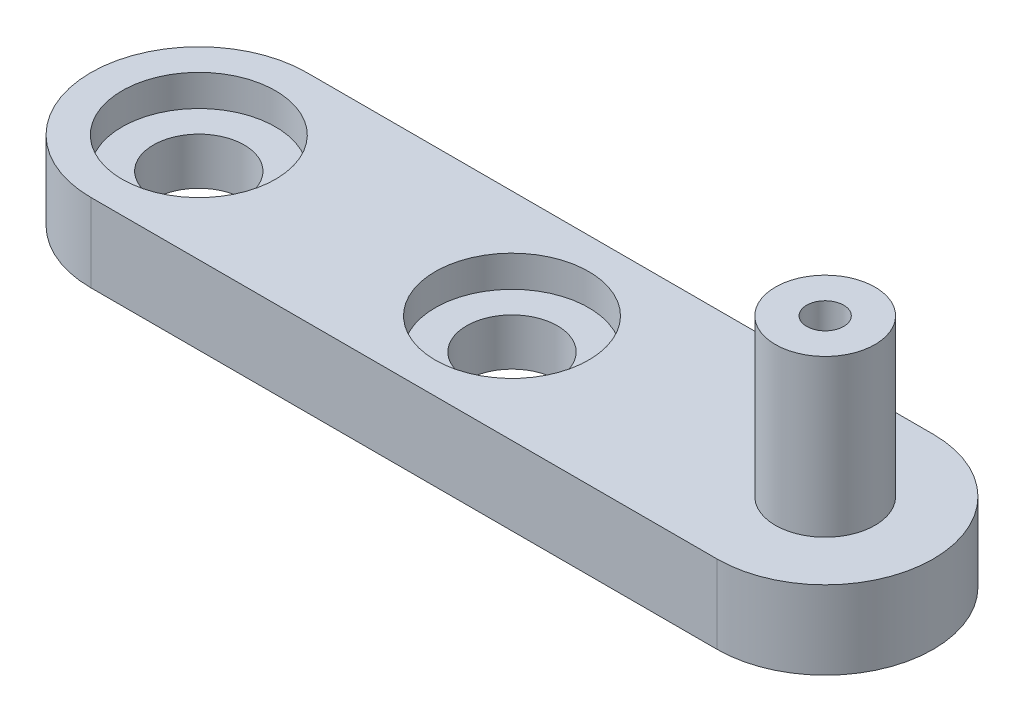
ISO-10303-21;
HEADER;
FILE_DESCRIPTION(('STEP AP214'),'2;1');
FILE_NAME('part.step','',(''),(''),'','','');
FILE_SCHEMA(('AUTOMOTIVE_DESIGN { 1 0 10303 214 1 1 1 1 }'));
ENDSEC;
DATA;
#1=APPLICATION_CONTEXT('core data for automotive mechanical design processes');
#2=APPLICATION_PROTOCOL_DEFINITION('international standard','automotive_design',2000,#1);
#3=PRODUCT_CONTEXT('',#1,'mechanical');
#4=PRODUCT('Part','Part','',(#3));
#5=PRODUCT_RELATED_PRODUCT_CATEGORY('part','',(#4));
#6=PRODUCT_DEFINITION_FORMATION('','',#4);
#7=PRODUCT_DEFINITION_CONTEXT('part definition',#1,'design');
#8=PRODUCT_DEFINITION('design','',#6,#7);
#9=PRODUCT_DEFINITION_SHAPE('','',#8);
#10=(LENGTH_UNIT() NAMED_UNIT(*) SI_UNIT(.MILLI.,.METRE.));
#11=(NAMED_UNIT(*) PLANE_ANGLE_UNIT() SI_UNIT($,.RADIAN.));
#12=(NAMED_UNIT(*) SI_UNIT($,.STERADIAN.) SOLID_ANGLE_UNIT());
#13=UNCERTAINTY_MEASURE_WITH_UNIT(LENGTH_MEASURE(1.E-05),#10,'distance_accuracy_value','');
#14=(GEOMETRIC_REPRESENTATION_CONTEXT(3) GLOBAL_UNCERTAINTY_ASSIGNED_CONTEXT((#13)) GLOBAL_UNIT_ASSIGNED_CONTEXT((#10,
#11,#12)) REPRESENTATION_CONTEXT('',''));
#15=CARTESIAN_POINT('',(0.,0.,0.));
#16=DIRECTION('',(0.,0.,1.));
#17=DIRECTION('',(1.,0.,0.));
#18=AXIS2_PLACEMENT_3D('',#15,#16,#17);
#19=CARTESIAN_POINT('',(0.,2.5,0.));
#20=DIRECTION('',(0.,-1.,0.));
#21=DIRECTION('',(0.,0.,-1.));
#22=AXIS2_PLACEMENT_3D('',#19,#20,#21);
#23=CYLINDRICAL_SURFACE('',#22,1.45);
#24=CARTESIAN_POINT('',(0.,0.,0.));
#25=DIRECTION('',(0.,1.,0.));
#26=DIRECTION('',(0.,0.,1.));
#27=AXIS2_PLACEMENT_3D('',#24,#25,#26);
#28=CIRCLE('',#27,1.45);
#29=CARTESIAN_POINT('',(0.,0.,1.45));
#30=VERTEX_POINT('',#29);
#31=EDGE_CURVE('E109',#30,#30,#28,.T.);
#32=ORIENTED_EDGE('',*,*,#31,.F.);
#33=EDGE_LOOP('',(#32));
#34=FACE_BOUND('',#33,.T.);
#35=CARTESIAN_POINT('',(0.,1.5,0.));
#36=DIRECTION('',(0.,1.,0.));
#37=DIRECTION('',(0.,0.,1.));
#38=AXIS2_PLACEMENT_3D('',#35,#36,#37);
#39=CIRCLE('',#38,1.45);
#40=CARTESIAN_POINT('',(0.,1.5,1.45));
#41=VERTEX_POINT('',#40);
#42=EDGE_CURVE('E118',#41,#41,#39,.T.);
#43=ORIENTED_EDGE('',*,*,#42,.T.);
#44=EDGE_LOOP('',(#43));
#45=FACE_BOUND('',#44,.T.);
#46=ADVANCED_FACE('F39',(#34,#45),#23,.F.);
#47=CARTESIAN_POINT('',(10.,2.5,0.));
#48=DIRECTION('',(0.,-1.,0.));
#49=DIRECTION('',(0.,0.,-1.));
#50=AXIS2_PLACEMENT_3D('',#47,#48,#49);
#51=CYLINDRICAL_SURFACE('',#50,1.45);
#52=CARTESIAN_POINT('',(10.,0.,0.));
#53=DIRECTION('',(0.,1.,0.));
#54=DIRECTION('',(0.,0.,1.));
#55=AXIS2_PLACEMENT_3D('',#52,#53,#54);
#56=CIRCLE('',#55,1.45);
#57=CARTESIAN_POINT('',(10.,0.,1.45));
#58=VERTEX_POINT('',#57);
#59=EDGE_CURVE('E121',#58,#58,#56,.T.);
#60=ORIENTED_EDGE('',*,*,#59,.F.);
#61=EDGE_LOOP('',(#60));
#62=FACE_BOUND('',#61,.T.);
#63=CARTESIAN_POINT('',(10.,1.5,0.));
#64=DIRECTION('',(0.,1.,0.));
#65=DIRECTION('',(0.,0.,1.));
#66=AXIS2_PLACEMENT_3D('',#63,#64,#65);
#67=CIRCLE('',#66,1.45);
#68=CARTESIAN_POINT('',(10.,1.5,1.45));
#69=VERTEX_POINT('',#68);
#70=EDGE_CURVE('E116',#69,#69,#67,.T.);
#71=ORIENTED_EDGE('',*,*,#70,.T.);
#72=EDGE_LOOP('',(#71));
#73=FACE_BOUND('',#72,.T.);
#74=ADVANCED_FACE('F187',(#62,#73),#51,.F.);
#75=CARTESIAN_POINT('',(0.,2.5,0.));
#76=DIRECTION('',(0.,1.,0.));
#77=DIRECTION('',(0.,0.,1.));
#78=AXIS2_PLACEMENT_3D('',#75,#76,#77);
#79=PLANE('',#78);
#80=CARTESIAN_POINT('',(20.,2.5,0.));
#81=DIRECTION('',(0.,1.,0.));
#82=DIRECTION('',(0.,0.,1.));
#83=AXIS2_PLACEMENT_3D('',#80,#81,#82);
#84=CIRCLE('',#83,1.59);
#85=CARTESIAN_POINT('',(20.,2.5,1.59));
#86=VERTEX_POINT('',#85);
#87=EDGE_CURVE('E143',#86,#86,#84,.T.);
#88=ORIENTED_EDGE('',*,*,#87,.F.);
#89=EDGE_LOOP('',(#88));
#90=FACE_BOUND('',#89,.T.);
#91=CARTESIAN_POINT('',(10.,2.5,0.));
#92=DIRECTION('',(0.,1.,0.));
#93=DIRECTION('',(0.,0.,1.));
#94=AXIS2_PLACEMENT_3D('',#91,#92,#93);
#95=CIRCLE('',#94,2.45);
#96=CARTESIAN_POINT('',(10.,2.5,2.45));
#97=VERTEX_POINT('',#96);
#98=EDGE_CURVE('E138',#97,#97,#95,.T.);
#99=ORIENTED_EDGE('',*,*,#98,.F.);
#100=EDGE_LOOP('',(#99));
#101=FACE_BOUND('',#100,.T.);
#102=CARTESIAN_POINT('',(0.,2.5,0.));
#103=DIRECTION('',(0.,1.,0.));
#104=DIRECTION('',(0.,0.,1.));
#105=AXIS2_PLACEMENT_3D('',#102,#103,#104);
#106=CIRCLE('',#105,2.45);
#107=CARTESIAN_POINT('',(0.,2.5,2.45));
#108=VERTEX_POINT('',#107);
#109=EDGE_CURVE('E134',#108,#108,#106,.T.);
#110=ORIENTED_EDGE('',*,*,#109,.F.);
#111=EDGE_LOOP('',(#110));
#112=FACE_BOUND('',#111,.T.);
#113=CARTESIAN_POINT('',(0.,2.5,0.));
#114=DIRECTION('',(0.,1.,0.));
#115=DIRECTION('',(0.,0.,1.));
#116=AXIS2_PLACEMENT_3D('',#113,#114,#115);
#117=CIRCLE('',#116,3.45);
#118=CARTESIAN_POINT('',(0.,2.5,-3.45));
#119=VERTEX_POINT('',#118);
#120=CARTESIAN_POINT('',(0.,2.5,3.45));
#121=VERTEX_POINT('',#120);
#122=EDGE_CURVE('E92',#119,#121,#117,.T.);
#123=ORIENTED_EDGE('',*,*,#122,.T.);
#124=DIRECTION('',(1.,0.,0.));
#125=VECTOR('',#124,1.);
#126=CARTESIAN_POINT('',(0.,2.5,3.45));
#127=LINE('',#126,#125);
#128=CARTESIAN_POINT('',(20.,2.5,3.45));
#129=VERTEX_POINT('',#128);
#130=EDGE_CURVE('E87',#121,#129,#127,.T.);
#131=ORIENTED_EDGE('',*,*,#130,.T.);
#132=CARTESIAN_POINT('',(20.,2.5,0.));
#133=DIRECTION('',(0.,1.,0.));
#134=DIRECTION('',(0.,0.,1.));
#135=AXIS2_PLACEMENT_3D('',#132,#133,#134);
#136=CIRCLE('',#135,3.45);
#137=CARTESIAN_POINT('',(20.,2.5,-3.45));
#138=VERTEX_POINT('',#137);
#139=EDGE_CURVE('E90',#129,#138,#136,.T.);
#140=ORIENTED_EDGE('',*,*,#139,.T.);
#141=DIRECTION('',(-1.,0.,0.));
#142=VECTOR('',#141,1.);
#143=CARTESIAN_POINT('',(0.,2.5,-3.45));
#144=LINE('',#143,#142);
#145=EDGE_CURVE('E56',#138,#119,#144,.T.);
#146=ORIENTED_EDGE('',*,*,#145,.T.);
#147=EDGE_LOOP('',(#123,#131,#140,#146));
#148=FACE_BOUND('',#147,.T.);
#149=ADVANCED_FACE('F88',(#90,#101,#112,#148),#79,.T.);
#150=CARTESIAN_POINT('',(0.,0.,0.));
#151=DIRECTION('',(0.,1.,0.));
#152=DIRECTION('',(0.,0.,1.));
#153=AXIS2_PLACEMENT_3D('',#150,#151,#152);
#154=PLANE('',#153);
#155=CARTESIAN_POINT('',(20.,0.,0.));
#156=DIRECTION('',(0.,1.,0.));
#157=DIRECTION('',(0.,0.,1.));
#158=AXIS2_PLACEMENT_3D('',#155,#156,#157);
#159=CIRCLE('',#158,0.475000000000004);
#160=CARTESIAN_POINT('',(20.,0.,0.475000000000004));
#161=VERTEX_POINT('',#160);
#162=EDGE_CURVE('E151',#161,#161,#159,.T.);
#163=ORIENTED_EDGE('',*,*,#162,.T.);
#164=EDGE_LOOP('',(#163));
#165=FACE_BOUND('',#164,.T.);
#166=CARTESIAN_POINT('',(0.,0.,0.));
#167=DIRECTION('',(0.,1.,0.));
#168=DIRECTION('',(0.,0.,1.));
#169=AXIS2_PLACEMENT_3D('',#166,#167,#168);
#170=CIRCLE('',#169,3.45);
#171=CARTESIAN_POINT('',(0.,0.,-3.45));
#172=VERTEX_POINT('',#171);
#173=CARTESIAN_POINT('',(0.,0.,3.45));
#174=VERTEX_POINT('',#173);
#175=EDGE_CURVE('E106',#172,#174,#170,.T.);
#176=ORIENTED_EDGE('',*,*,#175,.F.);
#177=DIRECTION('',(-1.,0.,0.));
#178=VECTOR('',#177,1.);
#179=CARTESIAN_POINT('',(0.,0.,-3.45));
#180=LINE('',#179,#178);
#181=CARTESIAN_POINT('',(20.,0.,-3.45));
#182=VERTEX_POINT('',#181);
#183=EDGE_CURVE('E79',#182,#172,#180,.T.);
#184=ORIENTED_EDGE('',*,*,#183,.F.);
#185=CARTESIAN_POINT('',(20.,0.,0.));
#186=DIRECTION('',(0.,1.,0.));
#187=DIRECTION('',(0.,0.,1.));
#188=AXIS2_PLACEMENT_3D('',#185,#186,#187);
#189=CIRCLE('',#188,3.45);
#190=CARTESIAN_POINT('',(20.,0.,3.45));
#191=VERTEX_POINT('',#190);
#192=EDGE_CURVE('E73',#191,#182,#189,.T.);
#193=ORIENTED_EDGE('',*,*,#192,.F.);
#194=DIRECTION('',(1.,0.,0.));
#195=VECTOR('',#194,1.);
#196=CARTESIAN_POINT('',(0.,0.,3.45));
#197=LINE('',#196,#195);
#198=EDGE_CURVE('E97',#174,#191,#197,.T.);
#199=ORIENTED_EDGE('',*,*,#198,.F.);
#200=EDGE_LOOP('',(#176,#184,#193,#199));
#201=FACE_BOUND('',#200,.T.);
#202=ORIENTED_EDGE('',*,*,#31,.T.);
#203=EDGE_LOOP('',(#202));
#204=FACE_BOUND('',#203,.T.);
#205=ORIENTED_EDGE('',*,*,#59,.T.);
#206=EDGE_LOOP('',(#205));
#207=FACE_BOUND('',#206,.T.);
#208=ADVANCED_FACE('F158',(#165,#201,#204,#207),#154,.F.);
#209=CARTESIAN_POINT('',(0.,2.5,0.));
#210=DIRECTION('',(0.,-1.,0.));
#211=DIRECTION('',(0.,0.,-1.));
#212=AXIS2_PLACEMENT_3D('',#209,#210,#211);
#213=CYLINDRICAL_SURFACE('',#212,3.45);
#214=ORIENTED_EDGE('',*,*,#175,.T.);
#215=DIRECTION('',(0.,-1.,0.));
#216=VECTOR('',#215,1.);
#217=CARTESIAN_POINT('',(0.,2.5,3.45));
#218=LINE('',#217,#216);
#219=EDGE_CURVE('E48',#121,#174,#218,.T.);
#220=ORIENTED_EDGE('',*,*,#219,.F.);
#221=ORIENTED_EDGE('',*,*,#122,.F.);
#222=DIRECTION('',(0.,-1.,0.));
#223=VECTOR('',#222,1.);
#224=CARTESIAN_POINT('',(0.,2.5,-3.45));
#225=LINE('',#224,#223);
#226=EDGE_CURVE('E102',#119,#172,#225,.T.);
#227=ORIENTED_EDGE('',*,*,#226,.T.);
#228=EDGE_LOOP('',(#214,#220,#221,#227));
#229=FACE_BOUND('',#228,.T.);
#230=ADVANCED_FACE('F41',(#229),#213,.T.);
#231=CARTESIAN_POINT('',(0.,2.5,3.45));
#232=DIRECTION('',(0.,0.,-1.));
#233=DIRECTION('',(-1.,0.,0.));
#234=AXIS2_PLACEMENT_3D('',#231,#232,#233);
#235=PLANE('',#234);
#236=ORIENTED_EDGE('',*,*,#198,.T.);
#237=DIRECTION('',(0.,-1.,0.));
#238=VECTOR('',#237,1.);
#239=CARTESIAN_POINT('',(20.,2.5,3.45));
#240=LINE('',#239,#238);
#241=EDGE_CURVE('E95',#129,#191,#240,.T.);
#242=ORIENTED_EDGE('',*,*,#241,.F.);
#243=ORIENTED_EDGE('',*,*,#130,.F.);
#244=ORIENTED_EDGE('',*,*,#219,.T.);
#245=EDGE_LOOP('',(#236,#242,#243,#244));
#246=FACE_BOUND('',#245,.T.);
#247=ADVANCED_FACE('F96',(#246),#235,.F.);
#248=CARTESIAN_POINT('',(20.,2.5,0.));
#249=DIRECTION('',(0.,-1.,0.));
#250=DIRECTION('',(0.,0.,-1.));
#251=AXIS2_PLACEMENT_3D('',#248,#249,#250);
#252=CYLINDRICAL_SURFACE('',#251,3.45);
#253=ORIENTED_EDGE('',*,*,#192,.T.);
#254=DIRECTION('',(0.,-1.,0.));
#255=VECTOR('',#254,1.);
#256=CARTESIAN_POINT('',(20.,2.5,-3.45));
#257=LINE('',#256,#255);
#258=EDGE_CURVE('E98',#138,#182,#257,.T.);
#259=ORIENTED_EDGE('',*,*,#258,.F.);
#260=ORIENTED_EDGE('',*,*,#139,.F.);
#261=ORIENTED_EDGE('',*,*,#241,.T.);
#262=EDGE_LOOP('',(#253,#259,#260,#261));
#263=FACE_BOUND('',#262,.T.);
#264=ADVANCED_FACE('F100',(#263),#252,.T.);
#265=CARTESIAN_POINT('',(0.,2.5,-3.45));
#266=DIRECTION('',(0.,0.,1.));
#267=DIRECTION('',(1.,0.,0.));
#268=AXIS2_PLACEMENT_3D('',#265,#266,#267);
#269=PLANE('',#268);
#270=ORIENTED_EDGE('',*,*,#183,.T.);
#271=ORIENTED_EDGE('',*,*,#226,.F.);
#272=ORIENTED_EDGE('',*,*,#145,.F.);
#273=ORIENTED_EDGE('',*,*,#258,.T.);
#274=EDGE_LOOP('',(#270,#271,#272,#273));
#275=FACE_BOUND('',#274,.T.);
#276=ADVANCED_FACE('F202',(#275),#269,.F.);
#277=CARTESIAN_POINT('',(10.,1.5,0.));
#278=DIRECTION('',(0.,1.,0.));
#279=DIRECTION('',(0.,0.,1.));
#280=AXIS2_PLACEMENT_3D('',#277,#278,#279);
#281=CYLINDRICAL_SURFACE('',#280,2.45);
#282=CARTESIAN_POINT('',(10.,1.5,0.));
#283=DIRECTION('',(0.,1.,0.));
#284=DIRECTION('',(0.,0.,1.));
#285=AXIS2_PLACEMENT_3D('',#282,#283,#284);
#286=CIRCLE('',#285,2.45);
#287=CARTESIAN_POINT('',(10.,1.5,2.45));
#288=VERTEX_POINT('',#287);
#289=EDGE_CURVE('E119',#288,#288,#286,.T.);
#290=ORIENTED_EDGE('',*,*,#289,.F.);
#291=EDGE_LOOP('',(#290));
#292=FACE_BOUND('',#291,.T.);
#293=ORIENTED_EDGE('',*,*,#98,.T.);
#294=EDGE_LOOP('',(#293));
#295=FACE_BOUND('',#294,.T.);
#296=ADVANCED_FACE('F204',(#292,#295),#281,.F.);
#297=CARTESIAN_POINT('',(10.,1.5,0.));
#298=DIRECTION('',(0.,1.,0.));
#299=DIRECTION('',(0.,0.,1.));
#300=AXIS2_PLACEMENT_3D('',#297,#298,#299);
#301=PLANE('',#300);
#302=ORIENTED_EDGE('',*,*,#70,.F.);
#303=EDGE_LOOP('',(#302));
#304=FACE_BOUND('',#303,.T.);
#305=ORIENTED_EDGE('',*,*,#289,.T.);
#306=EDGE_LOOP('',(#305));
#307=FACE_BOUND('',#306,.T.);
#308=ADVANCED_FACE('F255',(#304,#307),#301,.T.);
#309=CARTESIAN_POINT('',(0.,1.5,0.));
#310=DIRECTION('',(0.,1.,0.));
#311=DIRECTION('',(0.,0.,1.));
#312=AXIS2_PLACEMENT_3D('',#309,#310,#311);
#313=CYLINDRICAL_SURFACE('',#312,2.45);
#314=CARTESIAN_POINT('',(0.,1.5,0.));
#315=DIRECTION('',(0.,1.,0.));
#316=DIRECTION('',(0.,0.,1.));
#317=AXIS2_PLACEMENT_3D('',#314,#315,#316);
#318=CIRCLE('',#317,2.45);
#319=CARTESIAN_POINT('',(0.,1.5,2.45));
#320=VERTEX_POINT('',#319);
#321=EDGE_CURVE('E131',#320,#320,#318,.T.);
#322=ORIENTED_EDGE('',*,*,#321,.F.);
#323=EDGE_LOOP('',(#322));
#324=FACE_BOUND('',#323,.T.);
#325=ORIENTED_EDGE('',*,*,#109,.T.);
#326=EDGE_LOOP('',(#325));
#327=FACE_BOUND('',#326,.T.);
#328=ADVANCED_FACE('F265',(#324,#327),#313,.F.);
#329=CARTESIAN_POINT('',(0.,1.5,0.));
#330=DIRECTION('',(0.,1.,0.));
#331=DIRECTION('',(0.,0.,1.));
#332=AXIS2_PLACEMENT_3D('',#329,#330,#331);
#333=PLANE('',#332);
#334=ORIENTED_EDGE('',*,*,#42,.F.);
#335=EDGE_LOOP('',(#334));
#336=FACE_BOUND('',#335,.T.);
#337=ORIENTED_EDGE('',*,*,#321,.T.);
#338=EDGE_LOOP('',(#337));
#339=FACE_BOUND('',#338,.T.);
#340=ADVANCED_FACE('F275',(#336,#339),#333,.T.);
#341=CARTESIAN_POINT('',(20.,7.5,0.));
#342=DIRECTION('',(0.,1.,0.));
#343=DIRECTION('',(0.,0.,1.));
#344=AXIS2_PLACEMENT_3D('',#341,#342,#343);
#345=PLANE('',#344);
#346=CARTESIAN_POINT('',(20.,7.5,0.));
#347=DIRECTION('',(0.,1.,0.));
#348=DIRECTION('',(0.,0.,1.));
#349=AXIS2_PLACEMENT_3D('',#346,#347,#348);
#350=CIRCLE('',#349,1.59);
#351=CARTESIAN_POINT('',(20.,7.5,1.59));
#352=VERTEX_POINT('',#351);
#353=EDGE_CURVE('E135',#352,#352,#350,.T.);
#354=ORIENTED_EDGE('',*,*,#353,.T.);
#355=EDGE_LOOP('',(#354));
#356=FACE_BOUND('',#355,.T.);
#357=CARTESIAN_POINT('',(20.,7.5,0.));
#358=DIRECTION('',(0.,1.,0.));
#359=DIRECTION('',(0.,0.,1.));
#360=AXIS2_PLACEMENT_3D('',#357,#358,#359);
#361=CIRCLE('',#360,0.59);
#362=CARTESIAN_POINT('',(20.,7.5,0.59));
#363=VERTEX_POINT('',#362);
#364=EDGE_CURVE('E146',#363,#363,#361,.T.);
#365=ORIENTED_EDGE('',*,*,#364,.F.);
#366=EDGE_LOOP('',(#365));
#367=FACE_BOUND('',#366,.T.);
#368=ADVANCED_FACE('F182',(#356,#367),#345,.T.);
#369=CARTESIAN_POINT('',(20.,7.5,0.));
#370=DIRECTION('',(0.,-1.,0.));
#371=DIRECTION('',(0.,0.,-1.));
#372=AXIS2_PLACEMENT_3D('',#369,#370,#371);
#373=CYLINDRICAL_SURFACE('',#372,1.59);
#374=ORIENTED_EDGE('',*,*,#353,.F.);
#375=EDGE_LOOP('',(#374));
#376=FACE_BOUND('',#375,.T.);
#377=ORIENTED_EDGE('',*,*,#87,.T.);
#378=EDGE_LOOP('',(#377));
#379=FACE_BOUND('',#378,.T.);
#380=ADVANCED_FACE('F175',(#376,#379),#373,.T.);
#381=CARTESIAN_POINT('',(20.,7.5,0.));
#382=DIRECTION('',(0.,-1.,0.));
#383=DIRECTION('',(0.,0.,-1.));
#384=AXIS2_PLACEMENT_3D('',#381,#382,#383);
#385=CYLINDRICAL_SURFACE('',#384,0.59);
#386=ORIENTED_EDGE('',*,*,#364,.T.);
#387=EDGE_LOOP('',(#386));
#388=FACE_BOUND('',#387,.T.);
#389=CARTESIAN_POINT('',(20.,2.5,0.));
#390=DIRECTION('',(0.,1.,0.));
#391=DIRECTION('',(0.,0.,1.));
#392=AXIS2_PLACEMENT_3D('',#389,#390,#391);
#393=CIRCLE('',#392,0.59);
#394=CARTESIAN_POINT('',(20.,2.5,0.59));
#395=VERTEX_POINT('',#394);
#396=EDGE_CURVE('E11',#395,#395,#393,.F.);
#397=ORIENTED_EDGE('',*,*,#396,.T.);
#398=EDGE_LOOP('',(#397));
#399=FACE_BOUND('',#398,.T.);
#400=ADVANCED_FACE('F170',(#388,#399),#385,.F.);
#401=CARTESIAN_POINT('',(20.,2.5,0.));
#402=DIRECTION('',(0.,1.,0.));
#403=DIRECTION('',(0.,0.,1.));
#404=AXIS2_PLACEMENT_3D('',#401,#402,#403);
#405=CIRCLE('',#404,0.475000000000004);
#406=CARTESIAN_POINT('',(20.,2.5,0.475000000000004));
#407=VERTEX_POINT('',#406);
#408=EDGE_CURVE('E152',#407,#407,#405,.T.);
#409=ORIENTED_EDGE('',*,*,#408,.F.);
#410=EDGE_LOOP('',(#409));
#411=FACE_BOUND('',#410,.T.);
#412=ORIENTED_EDGE('',*,*,#396,.F.);
#413=EDGE_LOOP('',(#412));
#414=FACE_BOUND('',#413,.T.);
#415=ADVANCED_FACE('F164',(#411,#414),#79,.T.);
#416=CARTESIAN_POINT('',(20.,0.,0.));
#417=DIRECTION('',(0.,1.,0.));
#418=DIRECTION('',(0.,0.,1.));
#419=AXIS2_PLACEMENT_3D('',#416,#417,#418);
#420=CYLINDRICAL_SURFACE('',#419,0.475000000000004);
#421=ORIENTED_EDGE('',*,*,#162,.F.);
#422=EDGE_LOOP('',(#421));
#423=FACE_BOUND('',#422,.T.);
#424=ORIENTED_EDGE('',*,*,#408,.T.);
#425=EDGE_LOOP('',(#424));
#426=FACE_BOUND('',#425,.T.);
#427=ADVANCED_FACE('F161',(#423,#426),#420,.F.);
#428=CLOSED_SHELL('',(#46,#74,#149,#208,#230,#247,#264,#276,#296,#308,#328,#340,#368,#380,#400,
#415,#427));
#429=MANIFOLD_SOLID_BREP('B2',#428);
#430=ADVANCED_BREP_SHAPE_REPRESENTATION('',(#18,#429),#14);
#431=SHAPE_DEFINITION_REPRESENTATION(#9,#430);
ENDSEC;
END-ISO-10303-21;
